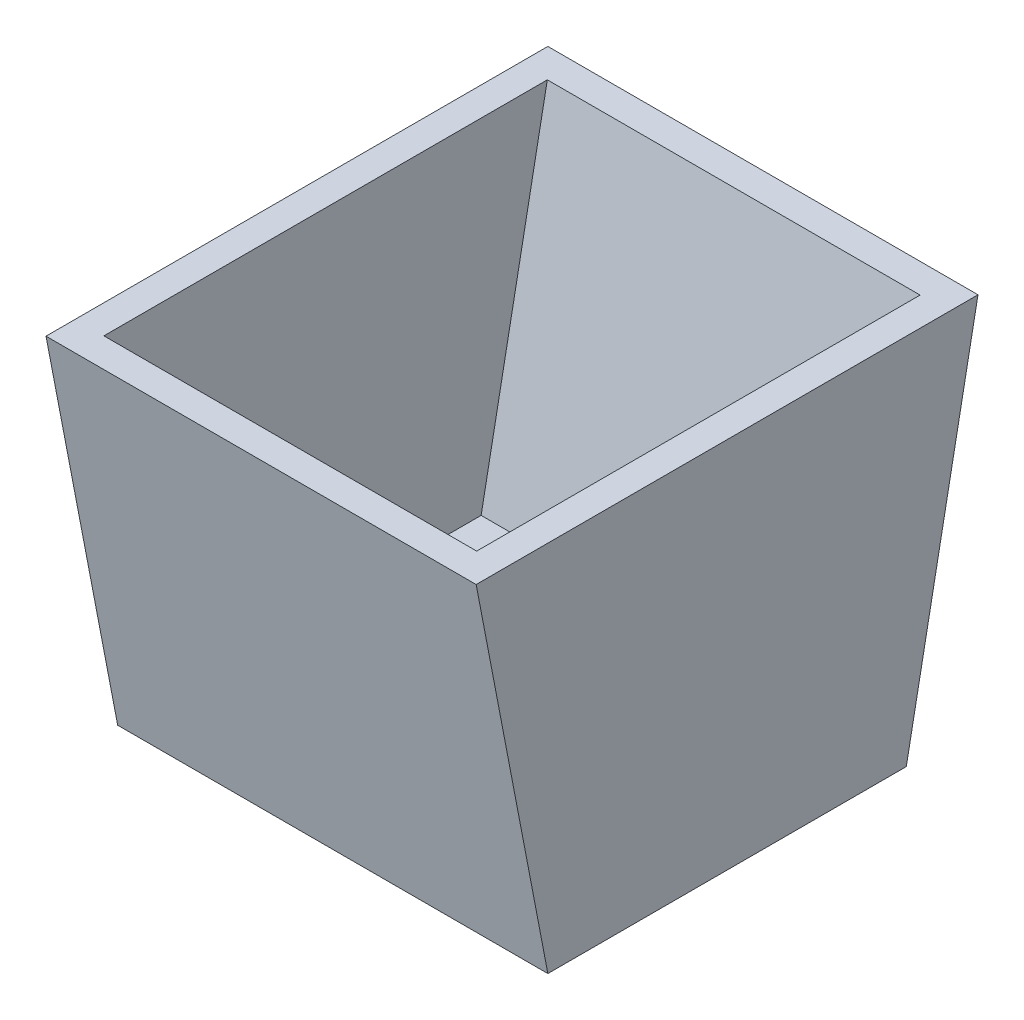
ISO-10303-21;
HEADER;
FILE_DESCRIPTION(('STEP AP214'),'2;1');
FILE_NAME('part.step','',(''),(''),'','','');
FILE_SCHEMA(('AUTOMOTIVE_DESIGN { 1 0 10303 214 1 1 1 1 }'));
ENDSEC;
DATA;
#1=APPLICATION_CONTEXT('core data for automotive mechanical design processes');
#2=APPLICATION_PROTOCOL_DEFINITION('international standard','automotive_design',2000,#1);
#3=PRODUCT_CONTEXT('',#1,'mechanical');
#4=PRODUCT('Part','Part','',(#3));
#5=PRODUCT_RELATED_PRODUCT_CATEGORY('part','',(#4));
#6=PRODUCT_DEFINITION_FORMATION('','',#4);
#7=PRODUCT_DEFINITION_CONTEXT('part definition',#1,'design');
#8=PRODUCT_DEFINITION('design','',#6,#7);
#9=PRODUCT_DEFINITION_SHAPE('','',#8);
#10=(LENGTH_UNIT() NAMED_UNIT(*) SI_UNIT(.MILLI.,.METRE.));
#11=(NAMED_UNIT(*) PLANE_ANGLE_UNIT() SI_UNIT($,.RADIAN.));
#12=(NAMED_UNIT(*) SI_UNIT($,.STERADIAN.) SOLID_ANGLE_UNIT());
#13=UNCERTAINTY_MEASURE_WITH_UNIT(LENGTH_MEASURE(1.E-05),#10,'distance_accuracy_value','');
#14=(GEOMETRIC_REPRESENTATION_CONTEXT(3) GLOBAL_UNCERTAINTY_ASSIGNED_CONTEXT((#13)) GLOBAL_UNIT_ASSIGNED_CONTEXT((#10,
#11,#12)) REPRESENTATION_CONTEXT('',''));
#15=CARTESIAN_POINT('',(0.,0.,0.));
#16=DIRECTION('',(0.,0.,1.));
#17=DIRECTION('',(1.,0.,0.));
#18=AXIS2_PLACEMENT_3D('',#15,#16,#17);
#19=CARTESIAN_POINT('',(30.,13.,-17.5));
#20=DIRECTION('',(0.,-1.,0.));
#21=DIRECTION('',(0.,0.,-1.));
#22=AXIS2_PLACEMENT_3D('',#19,#20,#21);
#23=PLANE('',#22);
#24=DIRECTION('',(0.,0.,1.));
#25=VECTOR('',#24,1.);
#26=CARTESIAN_POINT('',(0.,13.,-17.5));
#27=LINE('',#26,#25);
#28=CARTESIAN_POINT('',(0.,13.,-17.5));
#29=VERTEX_POINT('',#28);
#30=CARTESIAN_POINT('',(0.,13.,17.5));
#31=VERTEX_POINT('',#30);
#32=EDGE_CURVE('E87',#29,#31,#27,.T.);
#33=ORIENTED_EDGE('',*,*,#32,.T.);
#34=DIRECTION('',(-1.,0.,0.));
#35=VECTOR('',#34,1.);
#36=CARTESIAN_POINT('',(30.,13.,17.5));
#37=LINE('',#36,#35);
#38=CARTESIAN_POINT('',(30.,13.,17.5));
#39=VERTEX_POINT('',#38);
#40=EDGE_CURVE('E171',#39,#31,#37,.T.);
#41=ORIENTED_EDGE('',*,*,#40,.F.);
#42=DIRECTION('',(0.,0.,1.));
#43=VECTOR('',#42,1.);
#44=CARTESIAN_POINT('',(30.,13.,-17.5));
#45=LINE('',#44,#43);
#46=CARTESIAN_POINT('',(30.,13.,-17.5));
#47=VERTEX_POINT('',#46);
#48=EDGE_CURVE('E66',#47,#39,#45,.T.);
#49=ORIENTED_EDGE('',*,*,#48,.F.);
#50=DIRECTION('',(-1.,0.,0.));
#51=VECTOR('',#50,1.);
#52=CARTESIAN_POINT('',(30.,13.,-17.5));
#53=LINE('',#52,#51);
#54=EDGE_CURVE('E186',#47,#29,#53,.T.);
#55=ORIENTED_EDGE('',*,*,#54,.T.);
#56=EDGE_LOOP('',(#33,#41,#49,#55));
#57=FACE_BOUND('',#56,.T.);
#58=DIRECTION('',(0.,0.,1.));
#59=VECTOR('',#58,1.);
#60=CARTESIAN_POINT('',(2.,13.,0.));
#61=LINE('',#60,#59);
#62=CARTESIAN_POINT('',(2.,13.,-15.4633534930964));
#63=VERTEX_POINT('',#62);
#64=CARTESIAN_POINT('',(2.,13.,15.4633534930964));
#65=VERTEX_POINT('',#64);
#66=EDGE_CURVE('E143',#63,#65,#61,.T.);
#67=ORIENTED_EDGE('',*,*,#66,.F.);
#68=DIRECTION('',(-1.,0.,0.));
#69=VECTOR('',#68,1.);
#70=CARTESIAN_POINT('',(30.,13.,-15.4633534930964));
#71=LINE('',#70,#69);
#72=CARTESIAN_POINT('',(28.,13.,-15.4633534930964));
#73=VERTEX_POINT('',#72);
#74=EDGE_CURVE('E137',#73,#63,#71,.T.);
#75=ORIENTED_EDGE('',*,*,#74,.F.);
#76=DIRECTION('',(0.,0.,1.));
#77=VECTOR('',#76,1.);
#78=CARTESIAN_POINT('',(28.,13.,0.));
#79=LINE('',#78,#77);
#80=CARTESIAN_POINT('',(28.,13.,15.4633534930964));
#81=VERTEX_POINT('',#80);
#82=EDGE_CURVE('E57',#73,#81,#79,.T.);
#83=ORIENTED_EDGE('',*,*,#82,.T.);
#84=DIRECTION('',(-1.,0.,0.));
#85=VECTOR('',#84,1.);
#86=CARTESIAN_POINT('',(30.,13.,15.4633534930964));
#87=LINE('',#86,#85);
#88=EDGE_CURVE('E153',#81,#65,#87,.T.);
#89=ORIENTED_EDGE('',*,*,#88,.T.);
#90=EDGE_LOOP('',(#67,#75,#83,#89));
#91=FACE_BOUND('',#90,.T.);
#92=ADVANCED_FACE('F41',(#57,#91),#23,.F.);
#93=CARTESIAN_POINT('',(30.,13.,17.5));
#94=DIRECTION('',(0.,0.188847393650125,-0.982006446980647));
#95=DIRECTION('',(0.,0.982006446980647,0.188847393650125));
#96=AXIS2_PLACEMENT_3D('',#93,#94,#95);
#97=PLANE('',#96);
#98=DIRECTION('',(0.,-0.982006446980647,-0.188847393650125));
#99=VECTOR('',#98,1.);
#100=CARTESIAN_POINT('',(0.,13.,17.5));
#101=LINE('',#100,#99);
#102=CARTESIAN_POINT('',(0.,-13.,12.5));
#103=VERTEX_POINT('',#102);
#104=EDGE_CURVE('E172',#31,#103,#101,.T.);
#105=ORIENTED_EDGE('',*,*,#104,.T.);
#106=DIRECTION('',(-1.,0.,0.));
#107=VECTOR('',#106,1.);
#108=CARTESIAN_POINT('',(30.,-13.,12.5));
#109=LINE('',#108,#107);
#110=CARTESIAN_POINT('',(30.,-13.,12.5));
#111=VERTEX_POINT('',#110);
#112=EDGE_CURVE('E11',#111,#103,#109,.T.);
#113=ORIENTED_EDGE('',*,*,#112,.F.);
#114=DIRECTION('',(0.,-0.982006446980647,-0.188847393650125));
#115=VECTOR('',#114,1.);
#116=CARTESIAN_POINT('',(30.,13.,17.5));
#117=LINE('',#116,#115);
#118=EDGE_CURVE('E161',#39,#111,#117,.T.);
#119=ORIENTED_EDGE('',*,*,#118,.F.);
#120=ORIENTED_EDGE('',*,*,#40,.T.);
#121=EDGE_LOOP('',(#105,#113,#119,#120));
#122=FACE_BOUND('',#121,.T.);
#123=ADVANCED_FACE('F43',(#122),#97,.F.);
#124=CARTESIAN_POINT('',(30.,-13.,-12.5));
#125=DIRECTION('',(0.,1.,0.));
#126=DIRECTION('',(0.,0.,1.));
#127=AXIS2_PLACEMENT_3D('',#124,#125,#126);
#128=PLANE('',#127);
#129=DIRECTION('',(0.,0.,-1.));
#130=VECTOR('',#129,1.);
#131=CARTESIAN_POINT('',(0.,-13.,-12.5));
#132=LINE('',#131,#130);
#133=CARTESIAN_POINT('',(0.,-13.,-12.5));
#134=VERTEX_POINT('',#133);
#135=EDGE_CURVE('E176',#103,#134,#132,.T.);
#136=ORIENTED_EDGE('',*,*,#135,.T.);
#137=DIRECTION('',(-1.,0.,0.));
#138=VECTOR('',#137,1.);
#139=CARTESIAN_POINT('',(30.,-13.,-12.5));
#140=LINE('',#139,#138);
#141=CARTESIAN_POINT('',(30.,-13.,-12.5));
#142=VERTEX_POINT('',#141);
#143=EDGE_CURVE('E50',#142,#134,#140,.T.);
#144=ORIENTED_EDGE('',*,*,#143,.F.);
#145=DIRECTION('',(0.,0.,-1.));
#146=VECTOR('',#145,1.);
#147=CARTESIAN_POINT('',(30.,-13.,-12.5));
#148=LINE('',#147,#146);
#149=EDGE_CURVE('E94',#111,#142,#148,.T.);
#150=ORIENTED_EDGE('',*,*,#149,.F.);
#151=ORIENTED_EDGE('',*,*,#112,.T.);
#152=EDGE_LOOP('',(#136,#144,#150,#151));
#153=FACE_BOUND('',#152,.T.);
#154=ADVANCED_FACE('F231',(#153),#128,.F.);
#155=CARTESIAN_POINT('',(30.,13.,-17.5));
#156=DIRECTION('',(0.,0.188847393650125,0.982006446980647));
#157=DIRECTION('',(0.,-0.982006446980647,0.188847393650125));
#158=AXIS2_PLACEMENT_3D('',#155,#156,#157);
#159=PLANE('',#158);
#160=DIRECTION('',(0.,0.982006446980647,-0.188847393650125));
#161=VECTOR('',#160,1.);
#162=CARTESIAN_POINT('',(0.,13.,-17.5));
#163=LINE('',#162,#161);
#164=EDGE_CURVE('E179',#134,#29,#163,.T.);
#165=ORIENTED_EDGE('',*,*,#164,.T.);
#166=ORIENTED_EDGE('',*,*,#54,.F.);
#167=DIRECTION('',(0.,0.982006446980647,-0.188847393650125));
#168=VECTOR('',#167,1.);
#169=CARTESIAN_POINT('',(30.,13.,-17.5));
#170=LINE('',#169,#168);
#171=EDGE_CURVE('E166',#142,#47,#170,.T.);
#172=ORIENTED_EDGE('',*,*,#171,.F.);
#173=ORIENTED_EDGE('',*,*,#143,.T.);
#174=EDGE_LOOP('',(#165,#166,#172,#173));
#175=FACE_BOUND('',#174,.T.);
#176=ADVANCED_FACE('F193',(#175),#159,.F.);
#177=CARTESIAN_POINT('',(30.,0.,0.));
#178=DIRECTION('',(-1.,0.,0.));
#179=DIRECTION('',(0.,0.,1.));
#180=AXIS2_PLACEMENT_3D('',#177,#178,#179);
#181=PLANE('',#180);
#182=ORIENTED_EDGE('',*,*,#118,.T.);
#183=ORIENTED_EDGE('',*,*,#149,.T.);
#184=ORIENTED_EDGE('',*,*,#171,.T.);
#185=ORIENTED_EDGE('',*,*,#48,.T.);
#186=EDGE_LOOP('',(#182,#183,#184,#185));
#187=FACE_BOUND('',#186,.T.);
#188=ADVANCED_FACE('F225',(#187),#181,.F.);
#189=CARTESIAN_POINT('',(0.,0.,0.));
#190=DIRECTION('',(-1.,0.,0.));
#191=DIRECTION('',(0.,0.,1.));
#192=AXIS2_PLACEMENT_3D('',#189,#190,#191);
#193=PLANE('',#192);
#194=ORIENTED_EDGE('',*,*,#104,.F.);
#195=ORIENTED_EDGE('',*,*,#32,.F.);
#196=ORIENTED_EDGE('',*,*,#164,.F.);
#197=ORIENTED_EDGE('',*,*,#135,.F.);
#198=EDGE_LOOP('',(#194,#195,#196,#197));
#199=FACE_BOUND('',#198,.T.);
#200=ADVANCED_FACE('F197',(#199),#193,.T.);
#201=CARTESIAN_POINT('',(30.,13.3776947873002,15.5359871060387));
#202=DIRECTION('',(0.,0.188847393650125,-0.982006446980647));
#203=DIRECTION('',(0.,0.982006446980647,0.188847393650125));
#204=AXIS2_PLACEMENT_3D('',#201,#202,#203);
#205=PLANE('',#204);
#206=DIRECTION('',(0.,-0.982006446980647,-0.188847393650125));
#207=VECTOR('',#206,1.);
#208=CARTESIAN_POINT('',(2.,-2.40404558359847,12.501037034712));
#209=LINE('',#208,#207);
#210=CARTESIAN_POINT('',(2.,-11.,10.8479688777117));
#211=VERTEX_POINT('',#210);
#212=EDGE_CURVE('E124',#65,#211,#209,.T.);
#213=ORIENTED_EDGE('',*,*,#212,.F.);
#214=ORIENTED_EDGE('',*,*,#88,.F.);
#215=DIRECTION('',(0.,-0.982006446980647,-0.188847393650125));
#216=VECTOR('',#215,1.);
#217=CARTESIAN_POINT('',(28.,-2.40404558359847,12.501037034712));
#218=LINE('',#217,#216);
#219=CARTESIAN_POINT('',(28.,-11.,10.8479688777117));
#220=VERTEX_POINT('',#219);
#221=EDGE_CURVE('E146',#81,#220,#218,.T.);
#222=ORIENTED_EDGE('',*,*,#221,.T.);
#223=DIRECTION('',(-1.,0.,0.));
#224=VECTOR('',#223,1.);
#225=CARTESIAN_POINT('',(30.,-11.,10.8479688777117));
#226=LINE('',#225,#224);
#227=EDGE_CURVE('E136',#220,#211,#226,.T.);
#228=ORIENTED_EDGE('',*,*,#227,.T.);
#229=EDGE_LOOP('',(#213,#214,#222,#228));
#230=FACE_BOUND('',#229,.T.);
#231=ADVANCED_FACE('F205',(#230),#205,.T.);
#232=CARTESIAN_POINT('',(30.,-11.,-12.5));
#233=DIRECTION('',(0.,1.,0.));
#234=DIRECTION('',(0.,0.,1.));
#235=AXIS2_PLACEMENT_3D('',#232,#233,#234);
#236=PLANE('',#235);
#237=DIRECTION('',(0.,0.,-1.));
#238=VECTOR('',#237,1.);
#239=CARTESIAN_POINT('',(2.,-11.,0.));
#240=LINE('',#239,#238);
#241=CARTESIAN_POINT('',(2.,-11.,-10.8479688777117));
#242=VERTEX_POINT('',#241);
#243=EDGE_CURVE('E117',#211,#242,#240,.T.);
#244=ORIENTED_EDGE('',*,*,#243,.F.);
#245=ORIENTED_EDGE('',*,*,#227,.F.);
#246=DIRECTION('',(0.,0.,-1.));
#247=VECTOR('',#246,1.);
#248=CARTESIAN_POINT('',(28.,-11.,0.));
#249=LINE('',#248,#247);
#250=CARTESIAN_POINT('',(28.,-11.,-10.8479688777117));
#251=VERTEX_POINT('',#250);
#252=EDGE_CURVE('E133',#220,#251,#249,.T.);
#253=ORIENTED_EDGE('',*,*,#252,.T.);
#254=DIRECTION('',(-1.,0.,0.));
#255=VECTOR('',#254,1.);
#256=CARTESIAN_POINT('',(30.,-11.,-10.8479688777117));
#257=LINE('',#256,#255);
#258=EDGE_CURVE('E131',#251,#242,#257,.T.);
#259=ORIENTED_EDGE('',*,*,#258,.T.);
#260=EDGE_LOOP('',(#244,#245,#253,#259));
#261=FACE_BOUND('',#260,.T.);
#262=ADVANCED_FACE('F132',(#261),#236,.T.);
#263=CARTESIAN_POINT('',(30.,13.3776947873003,-15.5359871060387));
#264=DIRECTION('',(0.,0.188847393650125,0.982006446980647));
#265=DIRECTION('',(0.,-0.982006446980647,0.188847393650125));
#266=AXIS2_PLACEMENT_3D('',#263,#264,#265);
#267=PLANE('',#266);
#268=DIRECTION('',(0.,0.982006446980647,-0.188847393650125));
#269=VECTOR('',#268,1.);
#270=CARTESIAN_POINT('',(2.,-2.40404558359847,-12.501037034712));
#271=LINE('',#270,#269);
#272=EDGE_CURVE('E121',#242,#63,#271,.T.);
#273=ORIENTED_EDGE('',*,*,#272,.F.);
#274=ORIENTED_EDGE('',*,*,#258,.F.);
#275=DIRECTION('',(0.,0.982006446980647,-0.188847393650125));
#276=VECTOR('',#275,1.);
#277=CARTESIAN_POINT('',(28.,-2.40404558359847,-12.501037034712));
#278=LINE('',#277,#276);
#279=EDGE_CURVE('E150',#251,#73,#278,.T.);
#280=ORIENTED_EDGE('',*,*,#279,.T.);
#281=ORIENTED_EDGE('',*,*,#74,.T.);
#282=EDGE_LOOP('',(#273,#274,#280,#281));
#283=FACE_BOUND('',#282,.T.);
#284=ADVANCED_FACE('F139',(#283),#267,.T.);
#285=CARTESIAN_POINT('',(28.,0.,0.));
#286=DIRECTION('',(-1.,0.,0.));
#287=DIRECTION('',(0.,0.,1.));
#288=AXIS2_PLACEMENT_3D('',#285,#286,#287);
#289=PLANE('',#288);
#290=ORIENTED_EDGE('',*,*,#221,.F.);
#291=ORIENTED_EDGE('',*,*,#82,.F.);
#292=ORIENTED_EDGE('',*,*,#279,.F.);
#293=ORIENTED_EDGE('',*,*,#252,.F.);
#294=EDGE_LOOP('',(#290,#291,#292,#293));
#295=FACE_BOUND('',#294,.T.);
#296=ADVANCED_FACE('F214',(#295),#289,.T.);
#297=CARTESIAN_POINT('',(2.,0.,0.));
#298=DIRECTION('',(-1.,0.,0.));
#299=DIRECTION('',(0.,0.,1.));
#300=AXIS2_PLACEMENT_3D('',#297,#298,#299);
#301=PLANE('',#300);
#302=ORIENTED_EDGE('',*,*,#212,.T.);
#303=ORIENTED_EDGE('',*,*,#243,.T.);
#304=ORIENTED_EDGE('',*,*,#272,.T.);
#305=ORIENTED_EDGE('',*,*,#66,.T.);
#306=EDGE_LOOP('',(#302,#303,#304,#305));
#307=FACE_BOUND('',#306,.T.);
#308=ADVANCED_FACE('F119',(#307),#301,.F.);
#309=CLOSED_SHELL('',(#92,#123,#154,#176,#188,#200,#231,#262,#284,#296,#308));
#310=MANIFOLD_SOLID_BREP('B2',#309);
#311=ADVANCED_BREP_SHAPE_REPRESENTATION('',(#18,#310),#14);
#312=SHAPE_DEFINITION_REPRESENTATION(#9,#311);
ENDSEC;
END-ISO-10303-21;
